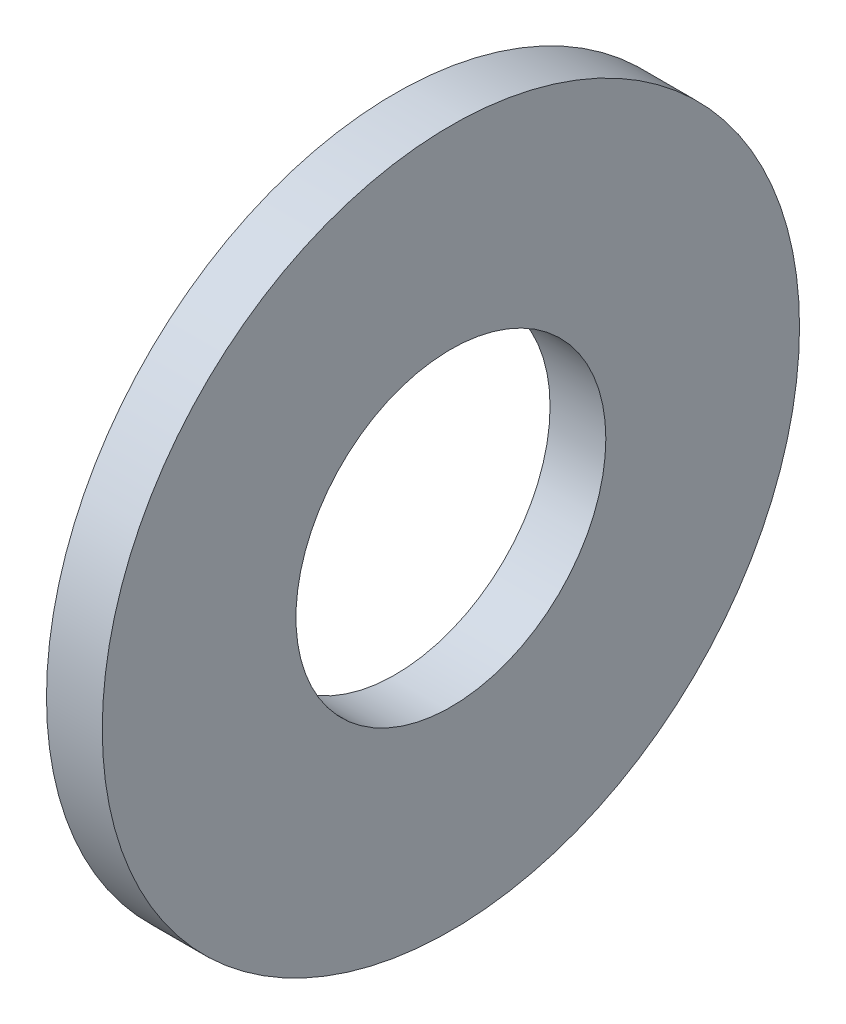
ISO-10303-21;
HEADER;
FILE_DESCRIPTION(('STEP AP214'),'2;1');
FILE_NAME('part.step','',(''),(''),'','','');
FILE_SCHEMA(('AUTOMOTIVE_DESIGN { 1 0 10303 214 1 1 1 1 }'));
ENDSEC;
DATA;
#1=APPLICATION_CONTEXT('core data for automotive mechanical design processes');
#2=APPLICATION_PROTOCOL_DEFINITION('international standard','automotive_design',2000,#1);
#3=PRODUCT_CONTEXT('',#1,'mechanical');
#4=PRODUCT('Part','Part','',(#3));
#5=PRODUCT_RELATED_PRODUCT_CATEGORY('part','',(#4));
#6=PRODUCT_DEFINITION_FORMATION('','',#4);
#7=PRODUCT_DEFINITION_CONTEXT('part definition',#1,'design');
#8=PRODUCT_DEFINITION('design','',#6,#7);
#9=PRODUCT_DEFINITION_SHAPE('','',#8);
#10=(LENGTH_UNIT() NAMED_UNIT(*) SI_UNIT(.MILLI.,.METRE.));
#11=(NAMED_UNIT(*) PLANE_ANGLE_UNIT() SI_UNIT($,.RADIAN.));
#12=(NAMED_UNIT(*) SI_UNIT($,.STERADIAN.) SOLID_ANGLE_UNIT());
#13=UNCERTAINTY_MEASURE_WITH_UNIT(LENGTH_MEASURE(1.E-05),#10,'distance_accuracy_value','');
#14=(GEOMETRIC_REPRESENTATION_CONTEXT(3) GLOBAL_UNCERTAINTY_ASSIGNED_CONTEXT((#13)) GLOBAL_UNIT_ASSIGNED_CONTEXT((#10,
#11,#12)) REPRESENTATION_CONTEXT('',''));
#15=CARTESIAN_POINT('',(0.,0.,0.));
#16=DIRECTION('',(0.,0.,1.));
#17=DIRECTION('',(1.,0.,0.));
#18=AXIS2_PLACEMENT_3D('',#15,#16,#17);
#19=CARTESIAN_POINT('',(0.9144,0.,0.));
#20=DIRECTION('',(1.,0.,0.));
#21=DIRECTION('',(0.,0.,-1.));
#22=AXIS2_PLACEMENT_3D('',#19,#20,#21);
#23=PLANE('',#22);
#24=CARTESIAN_POINT('',(0.9144,0.,0.));
#25=DIRECTION('',(1.,0.,0.));
#26=DIRECTION('',(0.,0.,-1.));
#27=AXIS2_PLACEMENT_3D('',#24,#25,#26);
#28=CIRCLE('',#27,5.715);
#29=CARTESIAN_POINT('',(0.9144,0.,-5.715));
#30=VERTEX_POINT('',#29);
#31=EDGE_CURVE('E10',#30,#30,#28,.T.);
#32=ORIENTED_EDGE('',*,*,#31,.T.);
#33=EDGE_LOOP('',(#32));
#34=FACE_BOUND('',#33,.T.);
#35=CARTESIAN_POINT('',(0.9144,0.,0.));
#36=DIRECTION('',(1.,0.,0.));
#37=DIRECTION('',(0.,0.,-1.));
#38=AXIS2_PLACEMENT_3D('',#35,#36,#37);
#39=CIRCLE('',#38,2.54);
#40=CARTESIAN_POINT('',(0.9144,0.,-2.54));
#41=VERTEX_POINT('',#40);
#42=EDGE_CURVE('E40',#41,#41,#39,.T.);
#43=ORIENTED_EDGE('',*,*,#42,.F.);
#44=EDGE_LOOP('',(#43));
#45=FACE_BOUND('',#44,.T.);
#46=ADVANCED_FACE('F29',(#34,#45),#23,.T.);
#47=CARTESIAN_POINT('',(0.,0.,0.));
#48=DIRECTION('',(1.,0.,0.));
#49=DIRECTION('',(0.,0.,-1.));
#50=AXIS2_PLACEMENT_3D('',#47,#48,#49);
#51=PLANE('',#50);
#52=CARTESIAN_POINT('',(0.,0.,0.));
#53=DIRECTION('',(1.,0.,0.));
#54=DIRECTION('',(0.,0.,-1.));
#55=AXIS2_PLACEMENT_3D('',#52,#53,#54);
#56=CIRCLE('',#55,5.715);
#57=CARTESIAN_POINT('',(0.,0.,-5.715));
#58=VERTEX_POINT('',#57);
#59=EDGE_CURVE('E33',#58,#58,#56,.T.);
#60=ORIENTED_EDGE('',*,*,#59,.F.);
#61=EDGE_LOOP('',(#60));
#62=FACE_BOUND('',#61,.T.);
#63=CARTESIAN_POINT('',(0.,0.,0.));
#64=DIRECTION('',(1.,0.,0.));
#65=DIRECTION('',(0.,0.,-1.));
#66=AXIS2_PLACEMENT_3D('',#63,#64,#65);
#67=CIRCLE('',#66,2.54);
#68=CARTESIAN_POINT('',(0.,0.,-2.54));
#69=VERTEX_POINT('',#68);
#70=EDGE_CURVE('E42',#69,#69,#67,.T.);
#71=ORIENTED_EDGE('',*,*,#70,.T.);
#72=EDGE_LOOP('',(#71));
#73=FACE_BOUND('',#72,.T.);
#74=ADVANCED_FACE('F52',(#62,#73),#51,.F.);
#75=CARTESIAN_POINT('',(0.9144,0.,0.));
#76=DIRECTION('',(-1.,0.,0.));
#77=DIRECTION('',(0.,0.,1.));
#78=AXIS2_PLACEMENT_3D('',#75,#76,#77);
#79=CYLINDRICAL_SURFACE('',#78,5.715);
#80=ORIENTED_EDGE('',*,*,#31,.F.);
#81=EDGE_LOOP('',(#80));
#82=FACE_BOUND('',#81,.T.);
#83=ORIENTED_EDGE('',*,*,#59,.T.);
#84=EDGE_LOOP('',(#83));
#85=FACE_BOUND('',#84,.T.);
#86=ADVANCED_FACE('F31',(#82,#85),#79,.T.);
#87=CARTESIAN_POINT('',(0.9144,0.,0.));
#88=DIRECTION('',(-1.,0.,0.));
#89=DIRECTION('',(0.,0.,1.));
#90=AXIS2_PLACEMENT_3D('',#87,#88,#89);
#91=CYLINDRICAL_SURFACE('',#90,2.54);
#92=ORIENTED_EDGE('',*,*,#42,.T.);
#93=EDGE_LOOP('',(#92));
#94=FACE_BOUND('',#93,.T.);
#95=ORIENTED_EDGE('',*,*,#70,.F.);
#96=EDGE_LOOP('',(#95));
#97=FACE_BOUND('',#96,.T.);
#98=ADVANCED_FACE('F48',(#94,#97),#91,.F.);
#99=CLOSED_SHELL('',(#46,#74,#86,#98));
#100=MANIFOLD_SOLID_BREP('B2',#99);
#101=ADVANCED_BREP_SHAPE_REPRESENTATION('',(#18,#100),#14);
#102=SHAPE_DEFINITION_REPRESENTATION(#9,#101);
ENDSEC;
END-ISO-10303-21;
